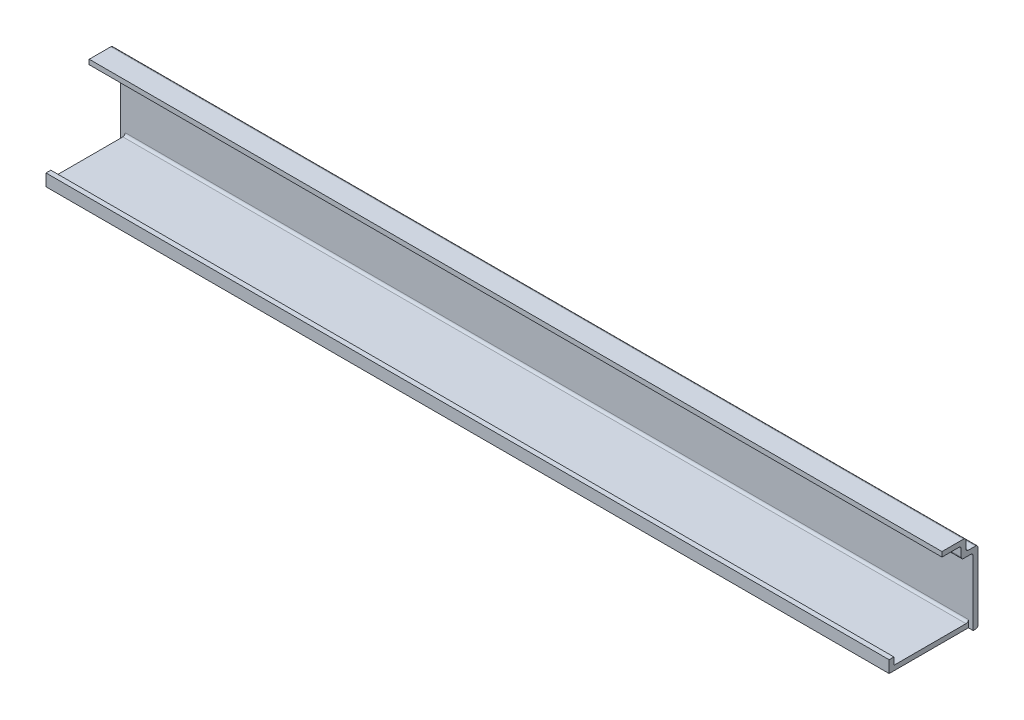
ISO-10303-21;
HEADER;
FILE_DESCRIPTION(('STEP AP214'),'2;1');
FILE_NAME('part.step','',(''),(''),'','','');
FILE_SCHEMA(('AUTOMOTIVE_DESIGN { 1 0 10303 214 1 1 1 1 }'));
ENDSEC;
DATA;
#1=APPLICATION_CONTEXT('core data for automotive mechanical design processes');
#2=APPLICATION_PROTOCOL_DEFINITION('international standard','automotive_design',2000,#1);
#3=PRODUCT_CONTEXT('',#1,'mechanical');
#4=PRODUCT('Part','Part','',(#3));
#5=PRODUCT_RELATED_PRODUCT_CATEGORY('part','',(#4));
#6=PRODUCT_DEFINITION_FORMATION('','',#4);
#7=PRODUCT_DEFINITION_CONTEXT('part definition',#1,'design');
#8=PRODUCT_DEFINITION('design','',#6,#7);
#9=PRODUCT_DEFINITION_SHAPE('','',#8);
#10=(LENGTH_UNIT() NAMED_UNIT(*) SI_UNIT(.MILLI.,.METRE.));
#11=(NAMED_UNIT(*) PLANE_ANGLE_UNIT() SI_UNIT($,.RADIAN.));
#12=(NAMED_UNIT(*) SI_UNIT($,.STERADIAN.) SOLID_ANGLE_UNIT());
#13=UNCERTAINTY_MEASURE_WITH_UNIT(LENGTH_MEASURE(1.E-05),#10,'distance_accuracy_value','');
#14=(GEOMETRIC_REPRESENTATION_CONTEXT(3) GLOBAL_UNCERTAINTY_ASSIGNED_CONTEXT((#13)) GLOBAL_UNIT_ASSIGNED_CONTEXT((#10,
#11,#12)) REPRESENTATION_CONTEXT('',''));
#15=CARTESIAN_POINT('',(0.,0.,0.));
#16=DIRECTION('',(0.,0.,1.));
#17=DIRECTION('',(1.,0.,0.));
#18=AXIS2_PLACEMENT_3D('',#15,#16,#17);
#19=CARTESIAN_POINT('',(-355.,0.,0.));
#20=DIRECTION('',(-1.,0.,0.));
#21=DIRECTION('',(0.,0.,1.));
#22=AXIS2_PLACEMENT_3D('',#19,#20,#21);
#23=PLANE('',#22);
#24=DIRECTION('',(0.,0.,-1.));
#25=VECTOR('',#24,1.);
#26=CARTESIAN_POINT('',(-355.,26.,-31.));
#27=LINE('',#26,#25);
#28=CARTESIAN_POINT('',(-355.,26.,-27.));
#29=VERTEX_POINT('',#28);
#30=CARTESIAN_POINT('',(-355.,26.,-30.));
#31=VERTEX_POINT('',#30);
#32=EDGE_CURVE('E353',#29,#31,#27,.T.);
#33=ORIENTED_EDGE('',*,*,#32,.F.);
#34=CARTESIAN_POINT('',(-355.,27.,-27.));
#35=DIRECTION('',(-1.,0.,0.));
#36=DIRECTION('',(0.,0.,1.));
#37=AXIS2_PLACEMENT_3D('',#34,#35,#36);
#38=CIRCLE('',#37,1.);
#39=CARTESIAN_POINT('',(-355.,27.,-26.));
#40=VERTEX_POINT('',#39);
#41=EDGE_CURVE('E11',#29,#40,#38,.T.);
#42=ORIENTED_EDGE('',*,*,#41,.T.);
#43=DIRECTION('',(0.,-1.,0.));
#44=VECTOR('',#43,1.);
#45=CARTESIAN_POINT('',(-355.,26.,-26.));
#46=LINE('',#45,#44);
#47=CARTESIAN_POINT('',(-355.,30.,-26.));
#48=VERTEX_POINT('',#47);
#49=EDGE_CURVE('E303',#48,#40,#46,.T.);
#50=ORIENTED_EDGE('',*,*,#49,.F.);
#51=CARTESIAN_POINT('',(-355.,30.,-25.));
#52=DIRECTION('',(-1.,0.,0.));
#53=DIRECTION('',(0.,0.,1.));
#54=AXIS2_PLACEMENT_3D('',#51,#52,#53);
#55=CIRCLE('',#54,1.);
#56=CARTESIAN_POINT('',(-355.,31.,-25.));
#57=VERTEX_POINT('',#56);
#58=EDGE_CURVE('E267',#48,#57,#55,.F.);
#59=ORIENTED_EDGE('',*,*,#58,.T.);
#60=DIRECTION('',(0.,0.,-1.));
#61=VECTOR('',#60,1.);
#62=CARTESIAN_POINT('',(-355.,31.,-26.));
#63=LINE('',#62,#61);
#64=CARTESIAN_POINT('',(-355.,31.,-18.));
#65=VERTEX_POINT('',#64);
#66=EDGE_CURVE('E356',#65,#57,#63,.T.);
#67=ORIENTED_EDGE('',*,*,#66,.F.);
#68=DIRECTION('',(0.,-1.,0.));
#69=VECTOR('',#68,1.);
#70=CARTESIAN_POINT('',(-355.,31.,-18.));
#71=LINE('',#70,#69);
#72=CARTESIAN_POINT('',(-355.,33.,-18.));
#73=VERTEX_POINT('',#72);
#74=EDGE_CURVE('E330',#73,#65,#71,.T.);
#75=ORIENTED_EDGE('',*,*,#74,.F.);
#76=DIRECTION('',(0.,0.,1.));
#77=VECTOR('',#76,1.);
#78=CARTESIAN_POINT('',(-355.,33.,-18.));
#79=LINE('',#78,#77);
#80=CARTESIAN_POINT('',(-355.,33.,-27.));
#81=VERTEX_POINT('',#80);
#82=EDGE_CURVE('E359',#81,#73,#79,.T.);
#83=ORIENTED_EDGE('',*,*,#82,.F.);
#84=CARTESIAN_POINT('',(-355.,32.,-27.));
#85=DIRECTION('',(-1.,0.,0.));
#86=DIRECTION('',(0.,0.,1.));
#87=AXIS2_PLACEMENT_3D('',#84,#85,#86);
#88=CIRCLE('',#87,1.);
#89=CARTESIAN_POINT('',(-355.,32.,-28.));
#90=VERTEX_POINT('',#89);
#91=EDGE_CURVE('E246',#81,#90,#88,.T.);
#92=ORIENTED_EDGE('',*,*,#91,.T.);
#93=DIRECTION('',(0.,1.,0.));
#94=VECTOR('',#93,1.);
#95=CARTESIAN_POINT('',(-355.,33.,-28.));
#96=LINE('',#95,#94);
#97=CARTESIAN_POINT('',(-355.,29.,-28.));
#98=VERTEX_POINT('',#97);
#99=EDGE_CURVE('E361',#98,#90,#96,.T.);
#100=ORIENTED_EDGE('',*,*,#99,.F.);
#101=CARTESIAN_POINT('',(-355.,29.,-29.));
#102=DIRECTION('',(-1.,0.,0.));
#103=DIRECTION('',(0.,0.,1.));
#104=AXIS2_PLACEMENT_3D('',#101,#102,#103);
#105=CIRCLE('',#104,1.);
#106=CARTESIAN_POINT('',(-355.,28.,-29.));
#107=VERTEX_POINT('',#106);
#108=EDGE_CURVE('E263',#98,#107,#105,.F.);
#109=ORIENTED_EDGE('',*,*,#108,.T.);
#110=DIRECTION('',(0.,0.,1.));
#111=VECTOR('',#110,1.);
#112=CARTESIAN_POINT('',(-355.,28.,-28.));
#113=LINE('',#112,#111);
#114=CARTESIAN_POINT('',(-355.,28.,-32.));
#115=VERTEX_POINT('',#114);
#116=EDGE_CURVE('E364',#115,#107,#113,.T.);
#117=ORIENTED_EDGE('',*,*,#116,.F.);
#118=CARTESIAN_POINT('',(-355.,27.,-32.));
#119=DIRECTION('',(-1.,0.,0.));
#120=DIRECTION('',(0.,0.,1.));
#121=AXIS2_PLACEMENT_3D('',#118,#119,#120);
#122=CIRCLE('',#121,1.);
#123=CARTESIAN_POINT('',(-355.,27.,-33.));
#124=VERTEX_POINT('',#123);
#125=EDGE_CURVE('E243',#115,#124,#122,.T.);
#126=ORIENTED_EDGE('',*,*,#125,.T.);
#127=DIRECTION('',(0.,1.,0.));
#128=VECTOR('',#127,1.);
#129=CARTESIAN_POINT('',(-355.,28.,-33.));
#130=LINE('',#129,#128);
#131=CARTESIAN_POINT('',(-355.,-1.,-33.));
#132=VERTEX_POINT('',#131);
#133=EDGE_CURVE('E367',#132,#124,#130,.T.);
#134=ORIENTED_EDGE('',*,*,#133,.F.);
#135=CARTESIAN_POINT('',(-355.,-1.,-32.));
#136=DIRECTION('',(-1.,0.,0.));
#137=DIRECTION('',(0.,0.,1.));
#138=AXIS2_PLACEMENT_3D('',#135,#136,#137);
#139=CIRCLE('',#138,1.);
#140=CARTESIAN_POINT('',(-355.,-2.,-32.));
#141=VERTEX_POINT('',#140);
#142=EDGE_CURVE('E281',#132,#141,#139,.T.);
#143=ORIENTED_EDGE('',*,*,#142,.T.);
#144=DIRECTION('',(0.,0.,-1.));
#145=VECTOR('',#144,1.);
#146=CARTESIAN_POINT('',(-355.,-2.,-33.));
#147=LINE('',#146,#145);
#148=CARTESIAN_POINT('',(-355.,-2.,-31.));
#149=VERTEX_POINT('',#148);
#150=EDGE_CURVE('E318',#149,#141,#147,.T.);
#151=ORIENTED_EDGE('',*,*,#150,.F.);
#152=DIRECTION('',(0.,-1.,0.));
#153=VECTOR('',#152,1.);
#154=CARTESIAN_POINT('',(-355.,0.,-31.));
#155=LINE('',#154,#153);
#156=CARTESIAN_POINT('',(-355.,25.,-31.));
#157=VERTEX_POINT('',#156);
#158=EDGE_CURVE('E222',#157,#149,#155,.T.);
#159=ORIENTED_EDGE('',*,*,#158,.F.);
#160=CARTESIAN_POINT('',(-355.,25.,-30.));
#161=DIRECTION('',(-1.,0.,0.));
#162=DIRECTION('',(0.,0.,1.));
#163=AXIS2_PLACEMENT_3D('',#160,#161,#162);
#164=CIRCLE('',#163,1.);
#165=EDGE_CURVE('E271',#157,#31,#164,.F.);
#166=ORIENTED_EDGE('',*,*,#165,.T.);
#167=EDGE_LOOP('',(#33,#42,#50,#59,#67,#75,#83,#92,#100,#109,#117,#126,#134,#143,#151,#159,#166));
#168=FACE_BOUND('',#167,.T.);
#169=ADVANCED_FACE('F33',(#168),#23,.T.);
#170=CARTESIAN_POINT('',(0.,0.,0.));
#171=DIRECTION('',(-1.,0.,0.));
#172=DIRECTION('',(0.,0.,1.));
#173=AXIS2_PLACEMENT_3D('',#170,#171,#172);
#174=PLANE('',#173);
#175=DIRECTION('',(0.,-1.,0.));
#176=VECTOR('',#175,1.);
#177=CARTESIAN_POINT('',(0.,26.,-26.));
#178=LINE('',#177,#176);
#179=CARTESIAN_POINT('',(0.,30.,-26.));
#180=VERTEX_POINT('',#179);
#181=CARTESIAN_POINT('',(0.,27.,-26.));
#182=VERTEX_POINT('',#181);
#183=EDGE_CURVE('E300',#180,#182,#178,.T.);
#184=ORIENTED_EDGE('',*,*,#183,.T.);
#185=CARTESIAN_POINT('',(0.,27.,-27.));
#186=DIRECTION('',(-1.,0.,0.));
#187=DIRECTION('',(0.,0.,1.));
#188=AXIS2_PLACEMENT_3D('',#185,#186,#187);
#189=CIRCLE('',#188,1.);
#190=CARTESIAN_POINT('',(0.,26.,-27.));
#191=VERTEX_POINT('',#190);
#192=EDGE_CURVE('E55',#182,#191,#189,.F.);
#193=ORIENTED_EDGE('',*,*,#192,.T.);
#194=DIRECTION('',(0.,0.,-1.));
#195=VECTOR('',#194,1.);
#196=CARTESIAN_POINT('',(0.,26.,-31.));
#197=LINE('',#196,#195);
#198=CARTESIAN_POINT('',(0.,26.,-30.));
#199=VERTEX_POINT('',#198);
#200=EDGE_CURVE('E308',#191,#199,#197,.T.);
#201=ORIENTED_EDGE('',*,*,#200,.T.);
#202=CARTESIAN_POINT('',(0.,25.,-30.));
#203=DIRECTION('',(-1.,0.,0.));
#204=DIRECTION('',(0.,0.,1.));
#205=AXIS2_PLACEMENT_3D('',#202,#203,#204);
#206=CIRCLE('',#205,1.);
#207=CARTESIAN_POINT('',(0.,25.,-31.));
#208=VERTEX_POINT('',#207);
#209=EDGE_CURVE('E269',#199,#208,#206,.T.);
#210=ORIENTED_EDGE('',*,*,#209,.T.);
#211=DIRECTION('',(0.,-1.,0.));
#212=VECTOR('',#211,1.);
#213=CARTESIAN_POINT('',(0.,0.,-31.));
#214=LINE('',#213,#212);
#215=CARTESIAN_POINT('',(0.,-2.,-31.));
#216=VERTEX_POINT('',#215);
#217=EDGE_CURVE('E311',#208,#216,#214,.T.);
#218=ORIENTED_EDGE('',*,*,#217,.T.);
#219=DIRECTION('',(0.,0.,-1.));
#220=VECTOR('',#219,1.);
#221=CARTESIAN_POINT('',(0.,-2.,-33.));
#222=LINE('',#221,#220);
#223=CARTESIAN_POINT('',(0.,-2.,-32.));
#224=VERTEX_POINT('',#223);
#225=EDGE_CURVE('E348',#216,#224,#222,.T.);
#226=ORIENTED_EDGE('',*,*,#225,.T.);
#227=CARTESIAN_POINT('',(0.,-1.,-32.));
#228=DIRECTION('',(-1.,0.,0.));
#229=DIRECTION('',(0.,0.,1.));
#230=AXIS2_PLACEMENT_3D('',#227,#228,#229);
#231=CIRCLE('',#230,1.);
#232=CARTESIAN_POINT('',(0.,-1.,-33.));
#233=VERTEX_POINT('',#232);
#234=EDGE_CURVE('E277',#224,#233,#231,.F.);
#235=ORIENTED_EDGE('',*,*,#234,.T.);
#236=DIRECTION('',(0.,1.,0.));
#237=VECTOR('',#236,1.);
#238=CARTESIAN_POINT('',(0.,28.,-33.));
#239=LINE('',#238,#237);
#240=CARTESIAN_POINT('',(0.,27.,-33.));
#241=VERTEX_POINT('',#240);
#242=EDGE_CURVE('E346',#233,#241,#239,.T.);
#243=ORIENTED_EDGE('',*,*,#242,.T.);
#244=CARTESIAN_POINT('',(0.,27.,-32.));
#245=DIRECTION('',(-1.,0.,0.));
#246=DIRECTION('',(0.,0.,1.));
#247=AXIS2_PLACEMENT_3D('',#244,#245,#246);
#248=CIRCLE('',#247,1.);
#249=CARTESIAN_POINT('',(0.,28.,-32.));
#250=VERTEX_POINT('',#249);
#251=EDGE_CURVE('E237',#241,#250,#248,.F.);
#252=ORIENTED_EDGE('',*,*,#251,.T.);
#253=DIRECTION('',(0.,0.,1.));
#254=VECTOR('',#253,1.);
#255=CARTESIAN_POINT('',(0.,28.,-28.));
#256=LINE('',#255,#254);
#257=CARTESIAN_POINT('',(0.,28.,-29.));
#258=VERTEX_POINT('',#257);
#259=EDGE_CURVE('E343',#250,#258,#256,.T.);
#260=ORIENTED_EDGE('',*,*,#259,.T.);
#261=CARTESIAN_POINT('',(0.,29.,-29.));
#262=DIRECTION('',(-1.,0.,0.));
#263=DIRECTION('',(0.,0.,1.));
#264=AXIS2_PLACEMENT_3D('',#261,#262,#263);
#265=CIRCLE('',#264,1.);
#266=CARTESIAN_POINT('',(0.,29.,-28.));
#267=VERTEX_POINT('',#266);
#268=EDGE_CURVE('E261',#258,#267,#265,.T.);
#269=ORIENTED_EDGE('',*,*,#268,.T.);
#270=DIRECTION('',(0.,1.,0.));
#271=VECTOR('',#270,1.);
#272=CARTESIAN_POINT('',(0.,33.,-28.));
#273=LINE('',#272,#271);
#274=CARTESIAN_POINT('',(0.,32.,-28.));
#275=VERTEX_POINT('',#274);
#276=EDGE_CURVE('E338',#267,#275,#273,.T.);
#277=ORIENTED_EDGE('',*,*,#276,.T.);
#278=CARTESIAN_POINT('',(0.,32.,-27.));
#279=DIRECTION('',(-1.,0.,0.));
#280=DIRECTION('',(0.,0.,1.));
#281=AXIS2_PLACEMENT_3D('',#278,#279,#280);
#282=CIRCLE('',#281,1.);
#283=CARTESIAN_POINT('',(0.,33.,-27.));
#284=VERTEX_POINT('',#283);
#285=EDGE_CURVE('E239',#275,#284,#282,.F.);
#286=ORIENTED_EDGE('',*,*,#285,.T.);
#287=DIRECTION('',(0.,0.,1.));
#288=VECTOR('',#287,1.);
#289=CARTESIAN_POINT('',(0.,33.,-18.));
#290=LINE('',#289,#288);
#291=CARTESIAN_POINT('',(0.,33.,-18.));
#292=VERTEX_POINT('',#291);
#293=EDGE_CURVE('E337',#284,#292,#290,.T.);
#294=ORIENTED_EDGE('',*,*,#293,.T.);
#295=DIRECTION('',(0.,-1.,0.));
#296=VECTOR('',#295,1.);
#297=CARTESIAN_POINT('',(0.,31.,-18.));
#298=LINE('',#297,#296);
#299=CARTESIAN_POINT('',(0.,31.,-18.));
#300=VERTEX_POINT('',#299);
#301=EDGE_CURVE('E313',#292,#300,#298,.T.);
#302=ORIENTED_EDGE('',*,*,#301,.T.);
#303=DIRECTION('',(0.,0.,-1.));
#304=VECTOR('',#303,1.);
#305=CARTESIAN_POINT('',(0.,31.,-26.));
#306=LINE('',#305,#304);
#307=CARTESIAN_POINT('',(0.,31.,-25.));
#308=VERTEX_POINT('',#307);
#309=EDGE_CURVE('E309',#300,#308,#306,.T.);
#310=ORIENTED_EDGE('',*,*,#309,.T.);
#311=CARTESIAN_POINT('',(0.,30.,-25.));
#312=DIRECTION('',(-1.,0.,0.));
#313=DIRECTION('',(0.,0.,1.));
#314=AXIS2_PLACEMENT_3D('',#311,#312,#313);
#315=CIRCLE('',#314,1.);
#316=EDGE_CURVE('E265',#308,#180,#315,.T.);
#317=ORIENTED_EDGE('',*,*,#316,.T.);
#318=EDGE_LOOP('',(#184,#193,#201,#210,#218,#226,#235,#243,#252,#260,#269,#277,#286,#294,#302,
#310,#317));
#319=FACE_BOUND('',#318,.T.);
#320=ADVANCED_FACE('F306',(#319),#174,.F.);
#321=CARTESIAN_POINT('',(-355.,3.,2.));
#322=DIRECTION('',(0.,1.,0.));
#323=DIRECTION('',(0.,0.,1.));
#324=AXIS2_PLACEMENT_3D('',#321,#322,#323);
#325=PLANE('',#324);
#326=DIRECTION('',(0.,0.,-1.));
#327=VECTOR('',#326,1.);
#328=CARTESIAN_POINT('',(-353.,3.,2.));
#329=LINE('',#328,#327);
#330=CARTESIAN_POINT('',(-353.,3.,2.));
#331=VERTEX_POINT('',#330);
#332=CARTESIAN_POINT('',(-353.,3.,0.));
#333=VERTEX_POINT('',#332);
#334=EDGE_CURVE('E382',#331,#333,#329,.T.);
#335=ORIENTED_EDGE('',*,*,#334,.F.);
#336=DIRECTION('',(1.,0.,0.));
#337=VECTOR('',#336,1.);
#338=CARTESIAN_POINT('',(-355.,3.,2.));
#339=LINE('',#338,#337);
#340=CARTESIAN_POINT('',(-2.,2.99999999999999,2.));
#341=VERTEX_POINT('',#340);
#342=EDGE_CURVE('E209',#331,#341,#339,.T.);
#343=ORIENTED_EDGE('',*,*,#342,.T.);
#344=DIRECTION('',(0.,0.,1.));
#345=VECTOR('',#344,1.);
#346=CARTESIAN_POINT('',(-2.,3.,2.));
#347=LINE('',#346,#345);
#348=CARTESIAN_POINT('',(-2.,3.,0.));
#349=VERTEX_POINT('',#348);
#350=EDGE_CURVE('E351',#349,#341,#347,.T.);
#351=ORIENTED_EDGE('',*,*,#350,.F.);
#352=DIRECTION('',(1.,0.,0.));
#353=VECTOR('',#352,1.);
#354=CARTESIAN_POINT('',(-355.,3.,0.));
#355=LINE('',#354,#353);
#356=EDGE_CURVE('E229',#333,#349,#355,.T.);
#357=ORIENTED_EDGE('',*,*,#356,.F.);
#358=EDGE_LOOP('',(#335,#343,#351,#357));
#359=FACE_BOUND('',#358,.T.);
#360=ADVANCED_FACE('F419',(#359),#325,.T.);
#361=CARTESIAN_POINT('',(-355.,3.,0.));
#362=DIRECTION('',(0.,0.,-1.));
#363=DIRECTION('',(-1.,0.,0.));
#364=AXIS2_PLACEMENT_3D('',#361,#362,#363);
#365=PLANE('',#364);
#366=DIRECTION('',(0.,-1.,0.));
#367=VECTOR('',#366,1.);
#368=CARTESIAN_POINT('',(-353.,3.,0.));
#369=LINE('',#368,#367);
#370=CARTESIAN_POINT('',(-353.,0.,0.));
#371=VERTEX_POINT('',#370);
#372=EDGE_CURVE('E386',#333,#371,#369,.T.);
#373=ORIENTED_EDGE('',*,*,#372,.F.);
#374=ORIENTED_EDGE('',*,*,#356,.T.);
#375=DIRECTION('',(0.,1.,0.));
#376=VECTOR('',#375,1.);
#377=CARTESIAN_POINT('',(-2.,3.,0.));
#378=LINE('',#377,#376);
#379=CARTESIAN_POINT('',(-2.,0.,0.));
#380=VERTEX_POINT('',#379);
#381=EDGE_CURVE('E372',#380,#349,#378,.T.);
#382=ORIENTED_EDGE('',*,*,#381,.F.);
#383=DIRECTION('',(1.,0.,0.));
#384=VECTOR('',#383,1.);
#385=CARTESIAN_POINT('',(-355.,0.,0.));
#386=LINE('',#385,#384);
#387=EDGE_CURVE('E320',#371,#380,#386,.T.);
#388=ORIENTED_EDGE('',*,*,#387,.F.);
#389=EDGE_LOOP('',(#373,#374,#382,#388));
#390=FACE_BOUND('',#389,.T.);
#391=ADVANCED_FACE('F424',(#390),#365,.T.);
#392=CARTESIAN_POINT('',(-355.,0.,0.));
#393=DIRECTION('',(0.,1.,0.));
#394=DIRECTION('',(0.,0.,1.));
#395=AXIS2_PLACEMENT_3D('',#392,#393,#394);
#396=PLANE('',#395);
#397=DIRECTION('',(0.,0.,1.));
#398=VECTOR('',#397,1.);
#399=CARTESIAN_POINT('',(-2.,0.,0.));
#400=LINE('',#399,#398);
#401=CARTESIAN_POINT('',(-2.,0.,-30.));
#402=VERTEX_POINT('',#401);
#403=EDGE_CURVE('E375',#402,#380,#400,.T.);
#404=ORIENTED_EDGE('',*,*,#403,.F.);
#405=DIRECTION('',(1.,0.,0.));
#406=VECTOR('',#405,1.);
#407=CARTESIAN_POINT('',(-353.,0.,-30.));
#408=LINE('',#407,#406);
#409=CARTESIAN_POINT('',(-353.,0.,-30.));
#410=VERTEX_POINT('',#409);
#411=EDGE_CURVE('E286',#402,#410,#408,.F.);
#412=ORIENTED_EDGE('',*,*,#411,.T.);
#413=DIRECTION('',(0.,0.,-1.));
#414=VECTOR('',#413,1.);
#415=CARTESIAN_POINT('',(-353.,0.,0.));
#416=LINE('',#415,#414);
#417=EDGE_CURVE('E388',#371,#410,#416,.T.);
#418=ORIENTED_EDGE('',*,*,#417,.F.);
#419=ORIENTED_EDGE('',*,*,#387,.T.);
#420=EDGE_LOOP('',(#404,#412,#418,#419));
#421=FACE_BOUND('',#420,.T.);
#422=ADVANCED_FACE('F427',(#421),#396,.T.);
#423=CARTESIAN_POINT('',(-355.,0.,-31.));
#424=DIRECTION('',(0.,0.,1.));
#425=DIRECTION('',(1.,0.,0.));
#426=AXIS2_PLACEMENT_3D('',#423,#424,#425);
#427=PLANE('',#426);
#428=DIRECTION('',(1.,0.,0.));
#429=VECTOR('',#428,1.);
#430=CARTESIAN_POINT('',(-2.,1.,-31.));
#431=LINE('',#430,#429);
#432=CARTESIAN_POINT('',(-353.,1.,-31.));
#433=VERTEX_POINT('',#432);
#434=CARTESIAN_POINT('',(-2.,1.,-31.));
#435=VERTEX_POINT('',#434);
#436=EDGE_CURVE('E283',#433,#435,#431,.T.);
#437=ORIENTED_EDGE('',*,*,#436,.T.);
#438=DIRECTION('',(0.,1.,0.));
#439=VECTOR('',#438,1.);
#440=CARTESIAN_POINT('',(-2.,-2.,-31.));
#441=LINE('',#440,#439);
#442=CARTESIAN_POINT('',(-2.,-2.,-31.));
#443=VERTEX_POINT('',#442);
#444=EDGE_CURVE('E379',#443,#435,#441,.T.);
#445=ORIENTED_EDGE('',*,*,#444,.F.);
#446=DIRECTION('',(-1.,0.,0.));
#447=VECTOR('',#446,1.);
#448=CARTESIAN_POINT('',(0.,-2.,-31.));
#449=LINE('',#448,#447);
#450=EDGE_CURVE('E377',#216,#443,#449,.T.);
#451=ORIENTED_EDGE('',*,*,#450,.F.);
#452=ORIENTED_EDGE('',*,*,#217,.F.);
#453=DIRECTION('',(1.,0.,0.));
#454=VECTOR('',#453,1.);
#455=CARTESIAN_POINT('',(-355.,25.,-31.));
#456=LINE('',#455,#454);
#457=EDGE_CURVE('E256',#208,#157,#456,.F.);
#458=ORIENTED_EDGE('',*,*,#457,.T.);
#459=ORIENTED_EDGE('',*,*,#158,.T.);
#460=DIRECTION('',(-1.,0.,0.));
#461=VECTOR('',#460,1.);
#462=CARTESIAN_POINT('',(-355.,-2.,-31.));
#463=LINE('',#462,#461);
#464=CARTESIAN_POINT('',(-353.,-2.,-31.));
#465=VERTEX_POINT('',#464);
#466=EDGE_CURVE('E391',#465,#149,#463,.T.);
#467=ORIENTED_EDGE('',*,*,#466,.F.);
#468=DIRECTION('',(0.,-1.,0.));
#469=VECTOR('',#468,1.);
#470=CARTESIAN_POINT('',(-353.,-2.,-31.));
#471=LINE('',#470,#469);
#472=EDGE_CURVE('E197',#433,#465,#471,.T.);
#473=ORIENTED_EDGE('',*,*,#472,.F.);
#474=EDGE_LOOP('',(#437,#445,#451,#452,#458,#459,#467,#473));
#475=FACE_BOUND('',#474,.T.);
#476=ADVANCED_FACE('F410',(#475),#427,.T.);
#477=CARTESIAN_POINT('',(-355.,26.,-31.));
#478=DIRECTION('',(0.,-1.,0.));
#479=DIRECTION('',(0.,0.,-1.));
#480=AXIS2_PLACEMENT_3D('',#477,#478,#479);
#481=PLANE('',#480);
#482=ORIENTED_EDGE('',*,*,#200,.F.);
#483=DIRECTION('',(1.,0.,0.));
#484=VECTOR('',#483,1.);
#485=CARTESIAN_POINT('',(-355.,26.,-27.));
#486=LINE('',#485,#484);
#487=EDGE_CURVE('E41',#191,#29,#486,.F.);
#488=ORIENTED_EDGE('',*,*,#487,.T.);
#489=ORIENTED_EDGE('',*,*,#32,.T.);
#490=DIRECTION('',(1.,0.,0.));
#491=VECTOR('',#490,1.);
#492=CARTESIAN_POINT('',(0.,26.,-30.));
#493=LINE('',#492,#491);
#494=EDGE_CURVE('E253',#31,#199,#493,.T.);
#495=ORIENTED_EDGE('',*,*,#494,.T.);
#496=EDGE_LOOP('',(#482,#488,#489,#495));
#497=FACE_BOUND('',#496,.T.);
#498=ADVANCED_FACE('F454',(#497),#481,.T.);
#499=CARTESIAN_POINT('',(-355.,26.,-26.));
#500=DIRECTION('',(0.,0.,1.));
#501=DIRECTION('',(1.,0.,0.));
#502=AXIS2_PLACEMENT_3D('',#499,#500,#501);
#503=PLANE('',#502);
#504=ORIENTED_EDGE('',*,*,#49,.T.);
#505=DIRECTION('',(1.,0.,0.));
#506=VECTOR('',#505,1.);
#507=CARTESIAN_POINT('',(-355.,27.,-26.));
#508=LINE('',#507,#506);
#509=EDGE_CURVE('E292',#40,#182,#508,.T.);
#510=ORIENTED_EDGE('',*,*,#509,.T.);
#511=ORIENTED_EDGE('',*,*,#183,.F.);
#512=DIRECTION('',(1.,0.,0.));
#513=VECTOR('',#512,1.);
#514=CARTESIAN_POINT('',(-355.,30.,-26.));
#515=LINE('',#514,#513);
#516=EDGE_CURVE('E251',#180,#48,#515,.F.);
#517=ORIENTED_EDGE('',*,*,#516,.T.);
#518=EDGE_LOOP('',(#504,#510,#511,#517));
#519=FACE_BOUND('',#518,.T.);
#520=ADVANCED_FACE('F299',(#519),#503,.T.);
#521=CARTESIAN_POINT('',(-355.,31.,-26.));
#522=DIRECTION('',(0.,-1.,0.));
#523=DIRECTION('',(0.,0.,-1.));
#524=AXIS2_PLACEMENT_3D('',#521,#522,#523);
#525=PLANE('',#524);
#526=ORIENTED_EDGE('',*,*,#66,.T.);
#527=DIRECTION('',(1.,0.,0.));
#528=VECTOR('',#527,1.);
#529=CARTESIAN_POINT('',(0.,31.,-25.));
#530=LINE('',#529,#528);
#531=EDGE_CURVE('E248',#57,#308,#530,.T.);
#532=ORIENTED_EDGE('',*,*,#531,.T.);
#533=ORIENTED_EDGE('',*,*,#309,.F.);
#534=DIRECTION('',(1.,0.,0.));
#535=VECTOR('',#534,1.);
#536=CARTESIAN_POINT('',(-355.,31.,-18.));
#537=LINE('',#536,#535);
#538=EDGE_CURVE('E220',#65,#300,#537,.T.);
#539=ORIENTED_EDGE('',*,*,#538,.F.);
#540=EDGE_LOOP('',(#526,#532,#533,#539));
#541=FACE_BOUND('',#540,.T.);
#542=ADVANCED_FACE('F334',(#541),#525,.T.);
#543=CARTESIAN_POINT('',(-355.,31.,-18.));
#544=DIRECTION('',(0.,0.,1.));
#545=DIRECTION('',(1.,0.,0.));
#546=AXIS2_PLACEMENT_3D('',#543,#544,#545);
#547=PLANE('',#546);
#548=ORIENTED_EDGE('',*,*,#301,.F.);
#549=DIRECTION('',(1.,0.,0.));
#550=VECTOR('',#549,1.);
#551=CARTESIAN_POINT('',(-355.,33.,-18.));
#552=LINE('',#551,#550);
#553=EDGE_CURVE('E217',#73,#292,#552,.T.);
#554=ORIENTED_EDGE('',*,*,#553,.F.);
#555=ORIENTED_EDGE('',*,*,#74,.T.);
#556=ORIENTED_EDGE('',*,*,#538,.T.);
#557=EDGE_LOOP('',(#548,#554,#555,#556));
#558=FACE_BOUND('',#557,.T.);
#559=ADVANCED_FACE('F326',(#558),#547,.T.);
#560=CARTESIAN_POINT('',(-355.,33.,-18.));
#561=DIRECTION('',(0.,1.,0.));
#562=DIRECTION('',(0.,0.,1.));
#563=AXIS2_PLACEMENT_3D('',#560,#561,#562);
#564=PLANE('',#563);
#565=ORIENTED_EDGE('',*,*,#293,.F.);
#566=DIRECTION('',(1.,0.,0.));
#567=VECTOR('',#566,1.);
#568=CARTESIAN_POINT('',(-355.,33.,-27.));
#569=LINE('',#568,#567);
#570=EDGE_CURVE('E241',#284,#81,#569,.F.);
#571=ORIENTED_EDGE('',*,*,#570,.T.);
#572=ORIENTED_EDGE('',*,*,#82,.T.);
#573=ORIENTED_EDGE('',*,*,#553,.T.);
#574=EDGE_LOOP('',(#565,#571,#572,#573));
#575=FACE_BOUND('',#574,.T.);
#576=ADVANCED_FACE('F463',(#575),#564,.T.);
#577=CARTESIAN_POINT('',(-355.,33.,-28.));
#578=DIRECTION('',(0.,0.,-1.));
#579=DIRECTION('',(-1.,0.,0.));
#580=AXIS2_PLACEMENT_3D('',#577,#578,#579);
#581=PLANE('',#580);
#582=ORIENTED_EDGE('',*,*,#276,.F.);
#583=DIRECTION('',(1.,0.,0.));
#584=VECTOR('',#583,1.);
#585=CARTESIAN_POINT('',(-355.,29.,-28.));
#586=LINE('',#585,#584);
#587=EDGE_CURVE('E235',#267,#98,#586,.F.);
#588=ORIENTED_EDGE('',*,*,#587,.T.);
#589=ORIENTED_EDGE('',*,*,#99,.T.);
#590=DIRECTION('',(1.,0.,0.));
#591=VECTOR('',#590,1.);
#592=CARTESIAN_POINT('',(-355.,32.,-28.));
#593=LINE('',#592,#591);
#594=EDGE_CURVE('E232',#90,#275,#593,.T.);
#595=ORIENTED_EDGE('',*,*,#594,.T.);
#596=EDGE_LOOP('',(#582,#588,#589,#595));
#597=FACE_BOUND('',#596,.T.);
#598=ADVANCED_FACE('F466',(#597),#581,.T.);
#599=CARTESIAN_POINT('',(-355.,28.,-28.));
#600=DIRECTION('',(0.,1.,0.));
#601=DIRECTION('',(0.,0.,1.));
#602=AXIS2_PLACEMENT_3D('',#599,#600,#601);
#603=PLANE('',#602);
#604=ORIENTED_EDGE('',*,*,#116,.T.);
#605=DIRECTION('',(1.,0.,0.));
#606=VECTOR('',#605,1.);
#607=CARTESIAN_POINT('',(0.,28.,-29.));
#608=LINE('',#607,#606);
#609=EDGE_CURVE('E228',#107,#258,#608,.T.);
#610=ORIENTED_EDGE('',*,*,#609,.T.);
#611=ORIENTED_EDGE('',*,*,#259,.F.);
#612=DIRECTION('',(1.,0.,0.));
#613=VECTOR('',#612,1.);
#614=CARTESIAN_POINT('',(-355.,28.,-32.));
#615=LINE('',#614,#613);
#616=EDGE_CURVE('E226',#250,#115,#615,.F.);
#617=ORIENTED_EDGE('',*,*,#616,.T.);
#618=EDGE_LOOP('',(#604,#610,#611,#617));
#619=FACE_BOUND('',#618,.T.);
#620=ADVANCED_FACE('F470',(#619),#603,.T.);
#621=CARTESIAN_POINT('',(-355.,28.,-33.));
#622=DIRECTION('',(0.,0.,-1.));
#623=DIRECTION('',(0.,1.,0.));
#624=AXIS2_PLACEMENT_3D('',#621,#622,#623);
#625=PLANE('',#624);
#626=ORIENTED_EDGE('',*,*,#242,.F.);
#627=DIRECTION('',(1.,0.,0.));
#628=VECTOR('',#627,1.);
#629=CARTESIAN_POINT('',(-355.,-1.,-33.));
#630=LINE('',#629,#628);
#631=EDGE_CURVE('E279',#233,#132,#630,.F.);
#632=ORIENTED_EDGE('',*,*,#631,.T.);
#633=ORIENTED_EDGE('',*,*,#133,.T.);
#634=DIRECTION('',(1.,0.,0.));
#635=VECTOR('',#634,1.);
#636=CARTESIAN_POINT('',(-355.,27.,-33.));
#637=LINE('',#636,#635);
#638=EDGE_CURVE('E258',#124,#241,#637,.T.);
#639=ORIENTED_EDGE('',*,*,#638,.T.);
#640=EDGE_LOOP('',(#626,#632,#633,#639));
#641=FACE_BOUND('',#640,.T.);
#642=ADVANCED_FACE('F474',(#641),#625,.T.);
#643=CARTESIAN_POINT('',(-355.,-2.,-33.));
#644=DIRECTION('',(0.,-1.,0.));
#645=DIRECTION('',(0.,0.,-1.));
#646=AXIS2_PLACEMENT_3D('',#643,#644,#645);
#647=PLANE('',#646);
#648=ORIENTED_EDGE('',*,*,#150,.T.);
#649=DIRECTION('',(1.,0.,0.));
#650=VECTOR('',#649,1.);
#651=CARTESIAN_POINT('',(-355.,-2.,-32.));
#652=LINE('',#651,#650);
#653=EDGE_CURVE('E274',#141,#224,#652,.T.);
#654=ORIENTED_EDGE('',*,*,#653,.T.);
#655=ORIENTED_EDGE('',*,*,#225,.F.);
#656=ORIENTED_EDGE('',*,*,#450,.T.);
#657=DIRECTION('',(0.,0.,1.));
#658=VECTOR('',#657,1.);
#659=CARTESIAN_POINT('',(-2.,-2.,-59.0180604101492));
#660=LINE('',#659,#658);
#661=CARTESIAN_POINT('',(-2.,-2.,2.));
#662=VERTEX_POINT('',#661);
#663=EDGE_CURVE('E216',#443,#662,#660,.T.);
#664=ORIENTED_EDGE('',*,*,#663,.T.);
#665=DIRECTION('',(1.,0.,0.));
#666=VECTOR('',#665,1.);
#667=CARTESIAN_POINT('',(-355.,-2.,2.));
#668=LINE('',#667,#666);
#669=CARTESIAN_POINT('',(-353.,-2.,2.));
#670=VERTEX_POINT('',#669);
#671=EDGE_CURVE('E207',#670,#662,#668,.T.);
#672=ORIENTED_EDGE('',*,*,#671,.F.);
#673=DIRECTION('',(0.,0.,1.));
#674=VECTOR('',#673,1.);
#675=CARTESIAN_POINT('',(-353.,-2.,-59.0713376952364));
#676=LINE('',#675,#674);
#677=EDGE_CURVE('E191',#465,#670,#676,.T.);
#678=ORIENTED_EDGE('',*,*,#677,.F.);
#679=ORIENTED_EDGE('',*,*,#466,.T.);
#680=EDGE_LOOP('',(#648,#654,#655,#656,#664,#672,#678,#679));
#681=FACE_BOUND('',#680,.T.);
#682=ADVANCED_FACE('F213',(#681),#647,.T.);
#683=CARTESIAN_POINT('',(-355.,-2.,2.));
#684=DIRECTION('',(0.,0.,1.));
#685=DIRECTION('',(0.,-1.,0.));
#686=AXIS2_PLACEMENT_3D('',#683,#684,#685);
#687=PLANE('',#686);
#688=DIRECTION('',(0.,1.,0.));
#689=VECTOR('',#688,1.);
#690=CARTESIAN_POINT('',(-353.,-2.,2.));
#691=LINE('',#690,#689);
#692=EDGE_CURVE('E194',#670,#331,#691,.T.);
#693=ORIENTED_EDGE('',*,*,#692,.F.);
#694=ORIENTED_EDGE('',*,*,#671,.T.);
#695=DIRECTION('',(0.,-1.,0.));
#696=VECTOR('',#695,1.);
#697=CARTESIAN_POINT('',(-2.,-2.,2.));
#698=LINE('',#697,#696);
#699=EDGE_CURVE('E380',#341,#662,#698,.T.);
#700=ORIENTED_EDGE('',*,*,#699,.F.);
#701=ORIENTED_EDGE('',*,*,#342,.F.);
#702=EDGE_LOOP('',(#693,#694,#700,#701));
#703=FACE_BOUND('',#702,.T.);
#704=ADVANCED_FACE('F205',(#703),#687,.T.);
#705=CARTESIAN_POINT('',(-2.,-2.,-59.0180604101492));
#706=DIRECTION('',(-1.,0.,0.));
#707=DIRECTION('',(0.,0.,1.));
#708=AXIS2_PLACEMENT_3D('',#705,#706,#707);
#709=PLANE('',#708);
#710=ORIENTED_EDGE('',*,*,#350,.T.);
#711=ORIENTED_EDGE('',*,*,#699,.T.);
#712=ORIENTED_EDGE('',*,*,#663,.F.);
#713=ORIENTED_EDGE('',*,*,#444,.T.);
#714=CARTESIAN_POINT('',(-2.,1.,-30.));
#715=DIRECTION('',(-1.,0.,0.));
#716=DIRECTION('',(0.,0.,1.));
#717=AXIS2_PLACEMENT_3D('',#714,#715,#716);
#718=CIRCLE('',#717,1.);
#719=EDGE_CURVE('E288',#435,#402,#718,.T.);
#720=ORIENTED_EDGE('',*,*,#719,.T.);
#721=ORIENTED_EDGE('',*,*,#403,.T.);
#722=ORIENTED_EDGE('',*,*,#381,.T.);
#723=EDGE_LOOP('',(#710,#711,#712,#713,#720,#721,#722));
#724=FACE_BOUND('',#723,.T.);
#725=ADVANCED_FACE('F414',(#724),#709,.F.);
#726=CARTESIAN_POINT('',(-353.,-2.,-59.0713376952364));
#727=DIRECTION('',(1.,0.,0.));
#728=DIRECTION('',(0.,0.,-1.));
#729=AXIS2_PLACEMENT_3D('',#726,#727,#728);
#730=PLANE('',#729);
#731=ORIENTED_EDGE('',*,*,#334,.T.);
#732=ORIENTED_EDGE('',*,*,#372,.T.);
#733=ORIENTED_EDGE('',*,*,#417,.T.);
#734=CARTESIAN_POINT('',(-353.,1.,-30.));
#735=DIRECTION('',(1.,0.,0.));
#736=DIRECTION('',(0.,0.,-1.));
#737=AXIS2_PLACEMENT_3D('',#734,#735,#736);
#738=CIRCLE('',#737,1.);
#739=EDGE_CURVE('E290',#410,#433,#738,.T.);
#740=ORIENTED_EDGE('',*,*,#739,.T.);
#741=ORIENTED_EDGE('',*,*,#472,.T.);
#742=ORIENTED_EDGE('',*,*,#677,.T.);
#743=ORIENTED_EDGE('',*,*,#692,.T.);
#744=EDGE_LOOP('',(#731,#732,#733,#740,#741,#742,#743));
#745=FACE_BOUND('',#744,.T.);
#746=ADVANCED_FACE('F193',(#745),#730,.F.);
#747=CARTESIAN_POINT('',(-355.,29.,-29.));
#748=DIRECTION('',(-1.,0.,0.));
#749=DIRECTION('',(0.,0.,1.));
#750=AXIS2_PLACEMENT_3D('',#747,#748,#749);
#751=CYLINDRICAL_SURFACE('',#750,1.);
#752=ORIENTED_EDGE('',*,*,#108,.F.);
#753=ORIENTED_EDGE('',*,*,#587,.F.);
#754=ORIENTED_EDGE('',*,*,#268,.F.);
#755=ORIENTED_EDGE('',*,*,#609,.F.);
#756=EDGE_LOOP('',(#752,#753,#754,#755));
#757=FACE_BOUND('',#756,.T.);
#758=ADVANCED_FACE('F485',(#757),#751,.F.);
#759=CARTESIAN_POINT('',(-355.,32.,-27.));
#760=DIRECTION('',(1.,0.,0.));
#761=DIRECTION('',(0.,0.,-1.));
#762=AXIS2_PLACEMENT_3D('',#759,#760,#761);
#763=CYLINDRICAL_SURFACE('',#762,1.);
#764=ORIENTED_EDGE('',*,*,#91,.F.);
#765=ORIENTED_EDGE('',*,*,#570,.F.);
#766=ORIENTED_EDGE('',*,*,#285,.F.);
#767=ORIENTED_EDGE('',*,*,#594,.F.);
#768=EDGE_LOOP('',(#764,#765,#766,#767));
#769=FACE_BOUND('',#768,.T.);
#770=ADVANCED_FACE('F488',(#769),#763,.T.);
#771=CARTESIAN_POINT('',(-355.,30.,-25.));
#772=DIRECTION('',(-1.,0.,0.));
#773=DIRECTION('',(0.,0.,1.));
#774=AXIS2_PLACEMENT_3D('',#771,#772,#773);
#775=CYLINDRICAL_SURFACE('',#774,1.);
#776=ORIENTED_EDGE('',*,*,#58,.F.);
#777=ORIENTED_EDGE('',*,*,#516,.F.);
#778=ORIENTED_EDGE('',*,*,#316,.F.);
#779=ORIENTED_EDGE('',*,*,#531,.F.);
#780=EDGE_LOOP('',(#776,#777,#778,#779));
#781=FACE_BOUND('',#780,.T.);
#782=ADVANCED_FACE('F492',(#781),#775,.F.);
#783=CARTESIAN_POINT('',(-355.,25.,-30.));
#784=DIRECTION('',(-1.,0.,0.));
#785=DIRECTION('',(0.,0.,1.));
#786=AXIS2_PLACEMENT_3D('',#783,#784,#785);
#787=CYLINDRICAL_SURFACE('',#786,1.);
#788=ORIENTED_EDGE('',*,*,#165,.F.);
#789=ORIENTED_EDGE('',*,*,#457,.F.);
#790=ORIENTED_EDGE('',*,*,#209,.F.);
#791=ORIENTED_EDGE('',*,*,#494,.F.);
#792=EDGE_LOOP('',(#788,#789,#790,#791));
#793=FACE_BOUND('',#792,.T.);
#794=ADVANCED_FACE('F496',(#793),#787,.F.);
#795=CARTESIAN_POINT('',(-355.,27.,-32.));
#796=DIRECTION('',(1.,0.,0.));
#797=DIRECTION('',(0.,0.,-1.));
#798=AXIS2_PLACEMENT_3D('',#795,#796,#797);
#799=CYLINDRICAL_SURFACE('',#798,1.);
#800=ORIENTED_EDGE('',*,*,#125,.F.);
#801=ORIENTED_EDGE('',*,*,#616,.F.);
#802=ORIENTED_EDGE('',*,*,#251,.F.);
#803=ORIENTED_EDGE('',*,*,#638,.F.);
#804=EDGE_LOOP('',(#800,#801,#802,#803));
#805=FACE_BOUND('',#804,.T.);
#806=ADVANCED_FACE('F437',(#805),#799,.T.);
#807=CARTESIAN_POINT('',(-355.,-1.,-32.));
#808=DIRECTION('',(1.,0.,0.));
#809=DIRECTION('',(0.,0.,-1.));
#810=AXIS2_PLACEMENT_3D('',#807,#808,#809);
#811=CYLINDRICAL_SURFACE('',#810,1.);
#812=ORIENTED_EDGE('',*,*,#142,.F.);
#813=ORIENTED_EDGE('',*,*,#631,.F.);
#814=ORIENTED_EDGE('',*,*,#234,.F.);
#815=ORIENTED_EDGE('',*,*,#653,.F.);
#816=EDGE_LOOP('',(#812,#813,#814,#815));
#817=FACE_BOUND('',#816,.T.);
#818=ADVANCED_FACE('F403',(#817),#811,.T.);
#819=CARTESIAN_POINT('',(-355.,1.,-30.));
#820=DIRECTION('',(-1.,0.,0.));
#821=DIRECTION('',(0.,0.,1.));
#822=AXIS2_PLACEMENT_3D('',#819,#820,#821);
#823=CYLINDRICAL_SURFACE('',#822,1.);
#824=ORIENTED_EDGE('',*,*,#739,.F.);
#825=ORIENTED_EDGE('',*,*,#411,.F.);
#826=ORIENTED_EDGE('',*,*,#719,.F.);
#827=ORIENTED_EDGE('',*,*,#436,.F.);
#828=EDGE_LOOP('',(#824,#825,#826,#827));
#829=FACE_BOUND('',#828,.T.);
#830=ADVANCED_FACE('F431',(#829),#823,.F.);
#831=CARTESIAN_POINT('',(-355.,27.,-27.));
#832=DIRECTION('',(1.,0.,0.));
#833=DIRECTION('',(0.,0.,-1.));
#834=AXIS2_PLACEMENT_3D('',#831,#832,#833);
#835=CYLINDRICAL_SURFACE('',#834,1.);
#836=ORIENTED_EDGE('',*,*,#41,.F.);
#837=ORIENTED_EDGE('',*,*,#487,.F.);
#838=ORIENTED_EDGE('',*,*,#192,.F.);
#839=ORIENTED_EDGE('',*,*,#509,.F.);
#840=EDGE_LOOP('',(#836,#837,#838,#839));
#841=FACE_BOUND('',#840,.T.);
#842=ADVANCED_FACE('F35',(#841),#835,.T.);
#843=CLOSED_SHELL('',(#169,#320,#360,#391,#422,#476,#498,#520,#542,#559,#576,#598,#620,#642,
#682,#704,#725,#746,#758,#770,#782,#794,#806,#818,#830,#842));
#844=MANIFOLD_SOLID_BREP('B2',#843);
#845=ADVANCED_BREP_SHAPE_REPRESENTATION('',(#18,#844),#14);
#846=SHAPE_DEFINITION_REPRESENTATION(#9,#845);
ENDSEC;
END-ISO-10303-21;
